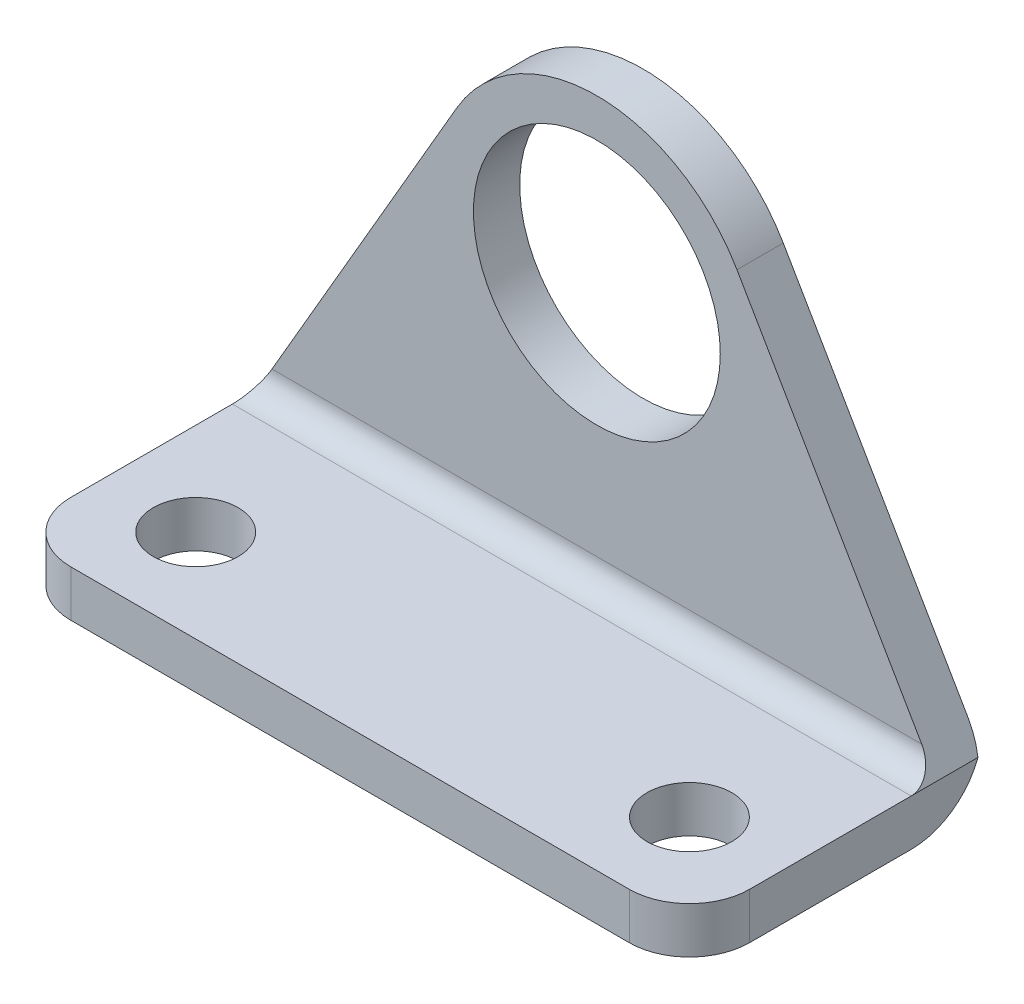
ISO-10303-21;
HEADER;
FILE_DESCRIPTION(('STEP AP214'),'2;1');
FILE_NAME('part.step','',(''),(''),'','','');
FILE_SCHEMA(('AUTOMOTIVE_DESIGN { 1 0 10303 214 1 1 1 1 }'));
ENDSEC;
DATA;
#1=APPLICATION_CONTEXT('core data for automotive mechanical design processes');
#2=APPLICATION_PROTOCOL_DEFINITION('international standard','automotive_design',2000,#1);
#3=PRODUCT_CONTEXT('',#1,'mechanical');
#4=PRODUCT('Part','Part','',(#3));
#5=PRODUCT_RELATED_PRODUCT_CATEGORY('part','',(#4));
#6=PRODUCT_DEFINITION_FORMATION('','',#4);
#7=PRODUCT_DEFINITION_CONTEXT('part definition',#1,'design');
#8=PRODUCT_DEFINITION('design','',#6,#7);
#9=PRODUCT_DEFINITION_SHAPE('','',#8);
#10=(LENGTH_UNIT() NAMED_UNIT(*) SI_UNIT(.MILLI.,.METRE.));
#11=(NAMED_UNIT(*) PLANE_ANGLE_UNIT() SI_UNIT($,.RADIAN.));
#12=(NAMED_UNIT(*) SI_UNIT($,.STERADIAN.) SOLID_ANGLE_UNIT());
#13=UNCERTAINTY_MEASURE_WITH_UNIT(LENGTH_MEASURE(1.E-05),#10,'distance_accuracy_value','');
#14=(GEOMETRIC_REPRESENTATION_CONTEXT(3) GLOBAL_UNCERTAINTY_ASSIGNED_CONTEXT((#13)) GLOBAL_UNIT_ASSIGNED_CONTEXT((#10,
#11,#12)) REPRESENTATION_CONTEXT('',''));
#15=CARTESIAN_POINT('',(0.,0.,0.));
#16=DIRECTION('',(0.,0.,1.));
#17=DIRECTION('',(1.,0.,0.));
#18=AXIS2_PLACEMENT_3D('',#15,#16,#17);
#19=CARTESIAN_POINT('',(22.,4.625,4.625));
#20=DIRECTION('',(-1.,0.,0.));
#21=DIRECTION('',(0.,0.,1.));
#22=AXIS2_PLACEMENT_3D('',#19,#20,#21);
#23=CYLINDRICAL_SURFACE('',#22,4.625);
#24=CARTESIAN_POINT('',(-21.057375262718,4.625,4.625));
#25=DIRECTION('',(-0.865002370637909,0.501767773766706,0.));
#26=DIRECTION('',(-0.501767773766707,-0.86500237063791,0.));
#27=AXIS2_PLACEMENT_3D('',#24,#25,#26);
#28=ELLIPSE('',#27,5.34680615567472,4.625);
#29=CARTESIAN_POINT('',(-21.057375262718,4.625,0.));
#30=VERTEX_POINT('',#29);
#31=CARTESIAN_POINT('',(-22.,3.,0.294872981077807));
#32=VERTEX_POINT('',#31);
#33=EDGE_CURVE('E156',#30,#32,#28,.T.);
#34=ORIENTED_EDGE('',*,*,#33,.F.);
#35=DIRECTION('',(-1.,0.,0.));
#36=VECTOR('',#35,1.);
#37=CARTESIAN_POINT('',(22.,4.625,0.));
#38=LINE('',#37,#36);
#39=CARTESIAN_POINT('',(21.057375262718,4.625,0.));
#40=VERTEX_POINT('',#39);
#41=EDGE_CURVE('E188',#40,#30,#38,.T.);
#42=ORIENTED_EDGE('',*,*,#41,.F.);
#43=CARTESIAN_POINT('',(21.057375262718,4.625,4.625));
#44=DIRECTION('',(0.865002370637909,0.501767773766706,0.));
#45=DIRECTION('',(-0.501767773766707,0.86500237063791,0.));
#46=AXIS2_PLACEMENT_3D('',#43,#44,#45);
#47=ELLIPSE('',#46,5.34680615567472,4.625);
#48=CARTESIAN_POINT('',(22.,3.,0.294872981077804));
#49=VERTEX_POINT('',#48);
#50=EDGE_CURVE('E163',#49,#40,#47,.T.);
#51=ORIENTED_EDGE('',*,*,#50,.F.);
#52=CARTESIAN_POINT('',(22.,4.625,4.625));
#53=DIRECTION('',(1.,0.,0.));
#54=DIRECTION('',(0.,0.,-1.));
#55=AXIS2_PLACEMENT_3D('',#52,#53,#54);
#56=CIRCLE('',#55,4.625);
#57=CARTESIAN_POINT('',(22.,0.,4.625));
#58=VERTEX_POINT('',#57);
#59=EDGE_CURVE('E169',#58,#49,#56,.T.);
#60=ORIENTED_EDGE('',*,*,#59,.F.);
#61=DIRECTION('',(-1.,0.,0.));
#62=VECTOR('',#61,1.);
#63=CARTESIAN_POINT('',(22.,0.,4.625));
#64=LINE('',#63,#62);
#65=CARTESIAN_POINT('',(-22.,0.,4.625));
#66=VERTEX_POINT('',#65);
#67=EDGE_CURVE('E191',#58,#66,#64,.T.);
#68=ORIENTED_EDGE('',*,*,#67,.T.);
#69=CARTESIAN_POINT('',(-22.,4.625,4.625));
#70=DIRECTION('',(1.,0.,0.));
#71=DIRECTION('',(0.,0.,-1.));
#72=AXIS2_PLACEMENT_3D('',#69,#70,#71);
#73=CIRCLE('',#72,4.625);
#74=EDGE_CURVE('E177',#66,#32,#73,.T.);
#75=ORIENTED_EDGE('',*,*,#74,.T.);
#76=EDGE_LOOP('',(#34,#42,#51,#60,#68,#75));
#77=FACE_BOUND('',#76,.T.);
#78=ADVANCED_FACE('F32',(#77),#23,.T.);
#79=CARTESIAN_POINT('',(22.,4.625,0.));
#80=DIRECTION('',(0.,0.,1.));
#81=DIRECTION('',(1.,0.,0.));
#82=AXIS2_PLACEMENT_3D('',#79,#80,#81);
#83=PLANE('',#82);
#84=CARTESIAN_POINT('',(0.,20.,0.));
#85=DIRECTION('',(0.,0.,1.));
#86=DIRECTION('',(1.,0.,0.));
#87=AXIS2_PLACEMENT_3D('',#84,#85,#86);
#88=CIRCLE('',#87,8.);
#89=CARTESIAN_POINT('',(8.,20.,0.));
#90=VERTEX_POINT('',#89);
#91=EDGE_CURVE('E146',#90,#90,#88,.T.);
#92=ORIENTED_EDGE('',*,*,#91,.T.);
#93=EDGE_LOOP('',(#92));
#94=FACE_BOUND('',#93,.T.);
#95=DIRECTION('',(-0.501767773766707,-0.86500237063791,0.));
#96=VECTOR('',#95,1.);
#97=CARTESIAN_POINT('',(-10.2167811932508,23.3132060974529,0.));
#98=LINE('',#97,#96);
#99=CARTESIAN_POINT('',(-9.08252489169805,25.2685616245504,0.));
#100=VERTEX_POINT('',#99);
#101=EDGE_CURVE('E140',#100,#30,#98,.T.);
#102=ORIENTED_EDGE('',*,*,#101,.F.);
#103=CARTESIAN_POINT('',(0.,20.,0.));
#104=DIRECTION('',(0.,0.,1.));
#105=DIRECTION('',(1.,0.,0.));
#106=AXIS2_PLACEMENT_3D('',#103,#104,#105);
#107=CIRCLE('',#106,10.5);
#108=CARTESIAN_POINT('',(9.08252489169805,25.2685616245504,0.));
#109=VERTEX_POINT('',#108);
#110=EDGE_CURVE('E144',#109,#100,#107,.T.);
#111=ORIENTED_EDGE('',*,*,#110,.F.);
#112=DIRECTION('',(-0.501767773766707,0.86500237063791,0.));
#113=VECTOR('',#112,1.);
#114=CARTESIAN_POINT('',(21.2947007400459,4.21587228946495,0.));
#115=LINE('',#114,#113);
#116=EDGE_CURVE('E161',#40,#109,#115,.T.);
#117=ORIENTED_EDGE('',*,*,#116,.F.);
#118=ORIENTED_EDGE('',*,*,#41,.T.);
#119=EDGE_LOOP('',(#102,#111,#117,#118));
#120=FACE_BOUND('',#119,.T.);
#121=ADVANCED_FACE('F241',(#94,#120),#83,.F.);
#122=CARTESIAN_POINT('',(22.,4.625,3.));
#123=DIRECTION('',(0.,0.,-1.));
#124=DIRECTION('',(-1.,0.,0.));
#125=AXIS2_PLACEMENT_3D('',#122,#123,#124);
#126=PLANE('',#125);
#127=CARTESIAN_POINT('',(0.,20.,3.));
#128=DIRECTION('',(0.,0.,1.));
#129=DIRECTION('',(1.,0.,0.));
#130=AXIS2_PLACEMENT_3D('',#127,#128,#129);
#131=CIRCLE('',#130,8.);
#132=CARTESIAN_POINT('',(8.,20.,3.));
#133=VERTEX_POINT('',#132);
#134=EDGE_CURVE('E150',#133,#133,#131,.T.);
#135=ORIENTED_EDGE('',*,*,#134,.F.);
#136=EDGE_LOOP('',(#135));
#137=FACE_BOUND('',#136,.T.);
#138=DIRECTION('',(0.501767773766707,0.86500237063791,0.));
#139=VECTOR('',#138,1.);
#140=CARTESIAN_POINT('',(-10.2167811932508,23.3132060974529,3.));
#141=LINE('',#140,#139);
#142=CARTESIAN_POINT('',(-21.057375262718,4.625,3.));
#143=VERTEX_POINT('',#142);
#144=CARTESIAN_POINT('',(-9.08252489169805,25.2685616245504,3.));
#145=VERTEX_POINT('',#144);
#146=EDGE_CURVE('E123',#143,#145,#141,.T.);
#147=ORIENTED_EDGE('',*,*,#146,.F.);
#148=DIRECTION('',(-1.,0.,0.));
#149=VECTOR('',#148,1.);
#150=CARTESIAN_POINT('',(22.,4.625,3.));
#151=LINE('',#150,#149);
#152=CARTESIAN_POINT('',(21.057375262718,4.625,3.));
#153=VERTEX_POINT('',#152);
#154=EDGE_CURVE('E186',#153,#143,#151,.T.);
#155=ORIENTED_EDGE('',*,*,#154,.F.);
#156=DIRECTION('',(0.501767773766707,-0.86500237063791,0.));
#157=VECTOR('',#156,1.);
#158=CARTESIAN_POINT('',(21.2947007400459,4.21587228946495,3.));
#159=LINE('',#158,#157);
#160=CARTESIAN_POINT('',(9.08252489169805,25.2685616245504,3.));
#161=VERTEX_POINT('',#160);
#162=EDGE_CURVE('E125',#161,#153,#159,.T.);
#163=ORIENTED_EDGE('',*,*,#162,.F.);
#164=CARTESIAN_POINT('',(0.,20.,3.));
#165=DIRECTION('',(0.,0.,-1.));
#166=DIRECTION('',(-1.,0.,0.));
#167=AXIS2_PLACEMENT_3D('',#164,#165,#166);
#168=CIRCLE('',#167,10.5);
#169=EDGE_CURVE('E119',#145,#161,#168,.T.);
#170=ORIENTED_EDGE('',*,*,#169,.F.);
#171=EDGE_LOOP('',(#147,#155,#163,#170));
#172=FACE_BOUND('',#171,.T.);
#173=ADVANCED_FACE('F121',(#137,#172),#126,.F.);
#174=CARTESIAN_POINT('',(22.,4.625,4.625));
#175=DIRECTION('',(-1.,0.,0.));
#176=DIRECTION('',(0.,0.,1.));
#177=AXIS2_PLACEMENT_3D('',#174,#175,#176);
#178=CYLINDRICAL_SURFACE('',#177,1.625);
#179=CARTESIAN_POINT('',(-21.057375262718,4.625,4.625));
#180=DIRECTION('',(-0.865002370637909,0.501767773766706,0.));
#181=DIRECTION('',(-0.501767773766707,-0.86500237063791,0.));
#182=AXIS2_PLACEMENT_3D('',#179,#180,#181);
#183=ELLIPSE('',#182,1.87860756821004,1.625);
#184=CARTESIAN_POINT('',(-22.,3.,4.625));
#185=VERTEX_POINT('',#184);
#186=EDGE_CURVE('E139',#185,#143,#183,.F.);
#187=ORIENTED_EDGE('',*,*,#186,.F.);
#188=DIRECTION('',(-1.,0.,0.));
#189=VECTOR('',#188,1.);
#190=CARTESIAN_POINT('',(22.,3.,4.625));
#191=LINE('',#190,#189);
#192=CARTESIAN_POINT('',(22.,3.,4.625));
#193=VERTEX_POINT('',#192);
#194=EDGE_CURVE('E183',#193,#185,#191,.T.);
#195=ORIENTED_EDGE('',*,*,#194,.F.);
#196=CARTESIAN_POINT('',(21.057375262718,4.625,4.625));
#197=DIRECTION('',(0.865002370637909,0.501767773766706,0.));
#198=DIRECTION('',(-0.501767773766707,0.86500237063791,0.));
#199=AXIS2_PLACEMENT_3D('',#196,#197,#198);
#200=ELLIPSE('',#199,1.87860756821004,1.625);
#201=EDGE_CURVE('E158',#153,#193,#200,.F.);
#202=ORIENTED_EDGE('',*,*,#201,.F.);
#203=ORIENTED_EDGE('',*,*,#154,.T.);
#204=EDGE_LOOP('',(#187,#195,#202,#203));
#205=FACE_BOUND('',#204,.T.);
#206=ADVANCED_FACE('F261',(#205),#178,.F.);
#207=CARTESIAN_POINT('',(22.,4.625,4.625));
#208=DIRECTION('',(1.,0.,0.));
#209=DIRECTION('',(0.,0.,-1.));
#210=AXIS2_PLACEMENT_3D('',#207,#208,#209);
#211=PLANE('',#210);
#212=DIRECTION('',(0.,0.,1.));
#213=VECTOR('',#212,1.);
#214=CARTESIAN_POINT('',(22.,3.,19.));
#215=LINE('',#214,#213);
#216=CARTESIAN_POINT('',(22.,3.,15.1));
#217=VERTEX_POINT('',#216);
#218=EDGE_CURVE('E173',#193,#217,#215,.T.);
#219=ORIENTED_EDGE('',*,*,#218,.T.);
#220=DIRECTION('',(0.,-1.,0.));
#221=VECTOR('',#220,1.);
#222=CARTESIAN_POINT('',(22.,0.,15.1));
#223=LINE('',#222,#221);
#224=CARTESIAN_POINT('',(22.,0.,15.1));
#225=VERTEX_POINT('',#224);
#226=EDGE_CURVE('E11',#217,#225,#223,.T.);
#227=ORIENTED_EDGE('',*,*,#226,.T.);
#228=DIRECTION('',(0.,0.,-1.));
#229=VECTOR('',#228,1.);
#230=CARTESIAN_POINT('',(22.,0.,19.));
#231=LINE('',#230,#229);
#232=EDGE_CURVE('E167',#225,#58,#231,.T.);
#233=ORIENTED_EDGE('',*,*,#232,.T.);
#234=ORIENTED_EDGE('',*,*,#59,.T.);
#235=DIRECTION('',(0.,0.,1.));
#236=VECTOR('',#235,1.);
#237=CARTESIAN_POINT('',(22.,3.,4.625));
#238=LINE('',#237,#236);
#239=EDGE_CURVE('E131',#49,#193,#238,.T.);
#240=ORIENTED_EDGE('',*,*,#239,.T.);
#241=EDGE_LOOP('',(#219,#227,#233,#234,#240));
#242=FACE_BOUND('',#241,.T.);
#243=ADVANCED_FACE('F232',(#242),#211,.T.);
#244=CARTESIAN_POINT('',(-22.,4.625,4.625));
#245=DIRECTION('',(1.,0.,0.));
#246=DIRECTION('',(0.,0.,-1.));
#247=AXIS2_PLACEMENT_3D('',#244,#245,#246);
#248=PLANE('',#247);
#249=DIRECTION('',(0.,0.,-1.));
#250=VECTOR('',#249,1.);
#251=CARTESIAN_POINT('',(-22.,0.,19.));
#252=LINE('',#251,#250);
#253=CARTESIAN_POINT('',(-22.,0.,15.1));
#254=VERTEX_POINT('',#253);
#255=EDGE_CURVE('E166',#254,#66,#252,.T.);
#256=ORIENTED_EDGE('',*,*,#255,.F.);
#257=DIRECTION('',(0.,-1.,0.));
#258=VECTOR('',#257,1.);
#259=CARTESIAN_POINT('',(-22.,4.625,15.1));
#260=LINE('',#259,#258);
#261=CARTESIAN_POINT('',(-22.,3.,15.1));
#262=VERTEX_POINT('',#261);
#263=EDGE_CURVE('E55',#254,#262,#260,.F.);
#264=ORIENTED_EDGE('',*,*,#263,.T.);
#265=DIRECTION('',(0.,0.,1.));
#266=VECTOR('',#265,1.);
#267=CARTESIAN_POINT('',(-22.,3.,19.));
#268=LINE('',#267,#266);
#269=EDGE_CURVE('E170',#185,#262,#268,.T.);
#270=ORIENTED_EDGE('',*,*,#269,.F.);
#271=DIRECTION('',(0.,0.,1.));
#272=VECTOR('',#271,1.);
#273=CARTESIAN_POINT('',(-22.,3.,4.625));
#274=LINE('',#273,#272);
#275=EDGE_CURVE('E197',#32,#185,#274,.T.);
#276=ORIENTED_EDGE('',*,*,#275,.F.);
#277=ORIENTED_EDGE('',*,*,#74,.F.);
#278=EDGE_LOOP('',(#256,#264,#270,#276,#277));
#279=FACE_BOUND('',#278,.T.);
#280=ADVANCED_FACE('F223',(#279),#248,.F.);
#281=CARTESIAN_POINT('',(22.,0.,19.));
#282=DIRECTION('',(0.,0.,-1.));
#283=DIRECTION('',(-1.,0.,0.));
#284=AXIS2_PLACEMENT_3D('',#281,#282,#283);
#285=PLANE('',#284);
#286=DIRECTION('',(-1.,0.,0.));
#287=VECTOR('',#286,1.);
#288=CARTESIAN_POINT('',(22.,3.,19.));
#289=LINE('',#288,#287);
#290=CARTESIAN_POINT('',(18.1,3.,19.));
#291=VERTEX_POINT('',#290);
#292=CARTESIAN_POINT('',(-18.1,3.,19.));
#293=VERTEX_POINT('',#292);
#294=EDGE_CURVE('E175',#291,#293,#289,.T.);
#295=ORIENTED_EDGE('',*,*,#294,.T.);
#296=DIRECTION('',(0.,-1.,0.));
#297=VECTOR('',#296,1.);
#298=CARTESIAN_POINT('',(-18.1,0.,19.));
#299=LINE('',#298,#297);
#300=CARTESIAN_POINT('',(-18.1,0.,19.));
#301=VERTEX_POINT('',#300);
#302=EDGE_CURVE('E202',#293,#301,#299,.T.);
#303=ORIENTED_EDGE('',*,*,#302,.T.);
#304=DIRECTION('',(-1.,0.,0.));
#305=VECTOR('',#304,1.);
#306=CARTESIAN_POINT('',(22.,0.,19.));
#307=LINE('',#306,#305);
#308=CARTESIAN_POINT('',(18.1,0.,19.));
#309=VERTEX_POINT('',#308);
#310=EDGE_CURVE('E194',#309,#301,#307,.T.);
#311=ORIENTED_EDGE('',*,*,#310,.F.);
#312=DIRECTION('',(0.,-1.,0.));
#313=VECTOR('',#312,1.);
#314=CARTESIAN_POINT('',(18.1,3.,19.));
#315=LINE('',#314,#313);
#316=EDGE_CURVE('E130',#309,#291,#315,.F.);
#317=ORIENTED_EDGE('',*,*,#316,.T.);
#318=EDGE_LOOP('',(#295,#303,#311,#317));
#319=FACE_BOUND('',#318,.T.);
#320=ADVANCED_FACE('F215',(#319),#285,.F.);
#321=CARTESIAN_POINT('',(22.,0.,19.));
#322=DIRECTION('',(0.,1.,0.));
#323=DIRECTION('',(0.,0.,1.));
#324=AXIS2_PLACEMENT_3D('',#321,#322,#323);
#325=PLANE('',#324);
#326=CARTESIAN_POINT('',(-16.,0.,13.));
#327=DIRECTION('',(0.,1.,0.));
#328=DIRECTION('',(0.,0.,-1.));
#329=AXIS2_PLACEMENT_3D('',#326,#327,#328);
#330=CIRCLE('',#329,2.75);
#331=CARTESIAN_POINT('',(-16.,0.,10.25));
#332=VERTEX_POINT('',#331);
#333=EDGE_CURVE('E284',#332,#332,#330,.T.);
#334=ORIENTED_EDGE('',*,*,#333,.T.);
#335=EDGE_LOOP('',(#334));
#336=FACE_BOUND('',#335,.T.);
#337=CARTESIAN_POINT('',(16.,0.,13.));
#338=DIRECTION('',(0.,1.,0.));
#339=DIRECTION('',(0.,0.,1.));
#340=AXIS2_PLACEMENT_3D('',#337,#338,#339);
#341=CIRCLE('',#340,2.75);
#342=CARTESIAN_POINT('',(16.,0.,15.75));
#343=VERTEX_POINT('',#342);
#344=EDGE_CURVE('E277',#343,#343,#341,.T.);
#345=ORIENTED_EDGE('',*,*,#344,.T.);
#346=EDGE_LOOP('',(#345));
#347=FACE_BOUND('',#346,.T.);
#348=ORIENTED_EDGE('',*,*,#310,.T.);
#349=CARTESIAN_POINT('',(-18.1,0.,15.1));
#350=DIRECTION('',(0.,1.,0.));
#351=DIRECTION('',(0.,0.,1.));
#352=AXIS2_PLACEMENT_3D('',#349,#350,#351);
#353=CIRCLE('',#352,3.9);
#354=EDGE_CURVE('E207',#301,#254,#353,.F.);
#355=ORIENTED_EDGE('',*,*,#354,.T.);
#356=ORIENTED_EDGE('',*,*,#255,.T.);
#357=ORIENTED_EDGE('',*,*,#67,.F.);
#358=ORIENTED_EDGE('',*,*,#232,.F.);
#359=CARTESIAN_POINT('',(18.1,0.,15.1));
#360=DIRECTION('',(0.,1.,0.));
#361=DIRECTION('',(0.,0.,1.));
#362=AXIS2_PLACEMENT_3D('',#359,#360,#361);
#363=CIRCLE('',#362,3.9);
#364=EDGE_CURVE('E205',#225,#309,#363,.F.);
#365=ORIENTED_EDGE('',*,*,#364,.T.);
#366=EDGE_LOOP('',(#348,#355,#356,#357,#358,#365));
#367=FACE_BOUND('',#366,.T.);
#368=ADVANCED_FACE('F220',(#336,#347,#367),#325,.F.);
#369=CARTESIAN_POINT('',(22.,3.,19.));
#370=DIRECTION('',(0.,-1.,0.));
#371=DIRECTION('',(0.,0.,-1.));
#372=AXIS2_PLACEMENT_3D('',#369,#370,#371);
#373=PLANE('',#372);
#374=CARTESIAN_POINT('',(-16.,3.,13.));
#375=DIRECTION('',(0.,1.,0.));
#376=DIRECTION('',(0.,0.,-1.));
#377=AXIS2_PLACEMENT_3D('',#374,#375,#376);
#378=CIRCLE('',#377,2.75);
#379=CARTESIAN_POINT('',(-16.,3.,10.25));
#380=VERTEX_POINT('',#379);
#381=EDGE_CURVE('E287',#380,#380,#378,.T.);
#382=ORIENTED_EDGE('',*,*,#381,.F.);
#383=EDGE_LOOP('',(#382));
#384=FACE_BOUND('',#383,.T.);
#385=CARTESIAN_POINT('',(16.,3.,13.));
#386=DIRECTION('',(0.,1.,0.));
#387=DIRECTION('',(0.,0.,1.));
#388=AXIS2_PLACEMENT_3D('',#385,#386,#387);
#389=CIRCLE('',#388,2.75);
#390=CARTESIAN_POINT('',(16.,3.,15.75));
#391=VERTEX_POINT('',#390);
#392=EDGE_CURVE('E279',#391,#391,#389,.T.);
#393=ORIENTED_EDGE('',*,*,#392,.F.);
#394=EDGE_LOOP('',(#393));
#395=FACE_BOUND('',#394,.T.);
#396=ORIENTED_EDGE('',*,*,#269,.T.);
#397=CARTESIAN_POINT('',(-18.1,3.,15.1));
#398=DIRECTION('',(0.,-1.,0.));
#399=DIRECTION('',(0.,0.,-1.));
#400=AXIS2_PLACEMENT_3D('',#397,#398,#399);
#401=CIRCLE('',#400,3.9);
#402=EDGE_CURVE('E40',#262,#293,#401,.F.);
#403=ORIENTED_EDGE('',*,*,#402,.T.);
#404=ORIENTED_EDGE('',*,*,#294,.F.);
#405=CARTESIAN_POINT('',(18.1,3.,15.1));
#406=DIRECTION('',(0.,-1.,0.));
#407=DIRECTION('',(0.,0.,-1.));
#408=AXIS2_PLACEMENT_3D('',#405,#406,#407);
#409=CIRCLE('',#408,3.9);
#410=EDGE_CURVE('E47',#291,#217,#409,.F.);
#411=ORIENTED_EDGE('',*,*,#410,.T.);
#412=ORIENTED_EDGE('',*,*,#218,.F.);
#413=ORIENTED_EDGE('',*,*,#194,.T.);
#414=EDGE_LOOP('',(#396,#403,#404,#411,#412,#413));
#415=FACE_BOUND('',#414,.T.);
#416=ADVANCED_FACE('F211',(#384,#395,#415),#373,.F.);
#417=CARTESIAN_POINT('',(0.,20.,71.4237541578243));
#418=DIRECTION('',(0.,0.,-1.));
#419=DIRECTION('',(-1.,0.,0.));
#420=AXIS2_PLACEMENT_3D('',#417,#418,#419);
#421=CYLINDRICAL_SURFACE('',#420,10.5);
#422=ORIENTED_EDGE('',*,*,#110,.T.);
#423=DIRECTION('',(0.,0.,-1.));
#424=VECTOR('',#423,1.);
#425=CARTESIAN_POINT('',(-9.08252489169805,25.2685616245504,71.4237541578243));
#426=LINE('',#425,#424);
#427=EDGE_CURVE('E136',#145,#100,#426,.T.);
#428=ORIENTED_EDGE('',*,*,#427,.F.);
#429=ORIENTED_EDGE('',*,*,#169,.T.);
#430=DIRECTION('',(0.,0.,-1.));
#431=VECTOR('',#430,1.);
#432=CARTESIAN_POINT('',(9.08252489169805,25.2685616245504,71.4237541578243));
#433=LINE('',#432,#431);
#434=EDGE_CURVE('E145',#161,#109,#433,.T.);
#435=ORIENTED_EDGE('',*,*,#434,.T.);
#436=EDGE_LOOP('',(#422,#428,#429,#435));
#437=FACE_BOUND('',#436,.T.);
#438=ADVANCED_FACE('F142',(#437),#421,.T.);
#439=CARTESIAN_POINT('',(9.08252489169805,25.2685616245504,71.4237541578243));
#440=DIRECTION('',(0.865002370637909,0.501767773766706,0.));
#441=DIRECTION('',(-0.501767773766707,0.86500237063791,0.));
#442=AXIS2_PLACEMENT_3D('',#439,#440,#441);
#443=PLANE('',#442);
#444=ORIENTED_EDGE('',*,*,#50,.T.);
#445=ORIENTED_EDGE('',*,*,#116,.T.);
#446=ORIENTED_EDGE('',*,*,#434,.F.);
#447=ORIENTED_EDGE('',*,*,#162,.T.);
#448=ORIENTED_EDGE('',*,*,#201,.T.);
#449=ORIENTED_EDGE('',*,*,#239,.F.);
#450=EDGE_LOOP('',(#444,#445,#446,#447,#448,#449));
#451=FACE_BOUND('',#450,.T.);
#452=ADVANCED_FACE('F313',(#451),#443,.T.);
#453=CARTESIAN_POINT('',(-9.08252489169805,25.2685616245504,71.4237541578243));
#454=DIRECTION('',(-0.865002370637909,0.501767773766706,0.));
#455=DIRECTION('',(-0.501767773766707,-0.86500237063791,0.));
#456=AXIS2_PLACEMENT_3D('',#453,#454,#455);
#457=PLANE('',#456);
#458=ORIENTED_EDGE('',*,*,#33,.T.);
#459=ORIENTED_EDGE('',*,*,#275,.T.);
#460=ORIENTED_EDGE('',*,*,#186,.T.);
#461=ORIENTED_EDGE('',*,*,#146,.T.);
#462=ORIENTED_EDGE('',*,*,#427,.T.);
#463=ORIENTED_EDGE('',*,*,#101,.T.);
#464=EDGE_LOOP('',(#458,#459,#460,#461,#462,#463));
#465=FACE_BOUND('',#464,.T.);
#466=ADVANCED_FACE('F135',(#465),#457,.T.);
#467=CARTESIAN_POINT('',(0.,20.,0.));
#468=DIRECTION('',(0.,0.,1.));
#469=DIRECTION('',(1.,0.,0.));
#470=AXIS2_PLACEMENT_3D('',#467,#468,#469);
#471=CYLINDRICAL_SURFACE('',#470,8.);
#472=ORIENTED_EDGE('',*,*,#91,.F.);
#473=EDGE_LOOP('',(#472));
#474=FACE_BOUND('',#473,.T.);
#475=ORIENTED_EDGE('',*,*,#134,.T.);
#476=EDGE_LOOP('',(#475));
#477=FACE_BOUND('',#476,.T.);
#478=ADVANCED_FACE('F302',(#474,#477),#471,.F.);
#479=CARTESIAN_POINT('',(16.,0.,13.));
#480=DIRECTION('',(0.,1.,0.));
#481=DIRECTION('',(0.,0.,1.));
#482=AXIS2_PLACEMENT_3D('',#479,#480,#481);
#483=CYLINDRICAL_SURFACE('',#482,2.75);
#484=ORIENTED_EDGE('',*,*,#344,.F.);
#485=EDGE_LOOP('',(#484));
#486=FACE_BOUND('',#485,.T.);
#487=ORIENTED_EDGE('',*,*,#392,.T.);
#488=EDGE_LOOP('',(#487));
#489=FACE_BOUND('',#488,.T.);
#490=ADVANCED_FACE('F295',(#486,#489),#483,.F.);
#491=CARTESIAN_POINT('',(-16.,0.,13.));
#492=DIRECTION('',(0.,1.,0.));
#493=DIRECTION('',(0.,0.,1.));
#494=AXIS2_PLACEMENT_3D('',#491,#492,#493);
#495=CYLINDRICAL_SURFACE('',#494,2.75);
#496=ORIENTED_EDGE('',*,*,#333,.F.);
#497=EDGE_LOOP('',(#496));
#498=FACE_BOUND('',#497,.T.);
#499=ORIENTED_EDGE('',*,*,#381,.T.);
#500=EDGE_LOOP('',(#499));
#501=FACE_BOUND('',#500,.T.);
#502=ADVANCED_FACE('F239',(#498,#501),#495,.F.);
#503=CARTESIAN_POINT('',(-18.1,0.,15.1));
#504=DIRECTION('',(0.,-1.,0.));
#505=DIRECTION('',(0.,0.,-1.));
#506=AXIS2_PLACEMENT_3D('',#503,#504,#505);
#507=CYLINDRICAL_SURFACE('',#506,3.9);
#508=ORIENTED_EDGE('',*,*,#402,.F.);
#509=ORIENTED_EDGE('',*,*,#263,.F.);
#510=ORIENTED_EDGE('',*,*,#354,.F.);
#511=ORIENTED_EDGE('',*,*,#302,.F.);
#512=EDGE_LOOP('',(#508,#509,#510,#511));
#513=FACE_BOUND('',#512,.T.);
#514=ADVANCED_FACE('F218',(#513),#507,.T.);
#515=CARTESIAN_POINT('',(18.1,4.625,15.1));
#516=DIRECTION('',(0.,1.,0.));
#517=DIRECTION('',(0.,0.,1.));
#518=AXIS2_PLACEMENT_3D('',#515,#516,#517);
#519=CYLINDRICAL_SURFACE('',#518,3.9);
#520=ORIENTED_EDGE('',*,*,#410,.F.);
#521=ORIENTED_EDGE('',*,*,#316,.F.);
#522=ORIENTED_EDGE('',*,*,#364,.F.);
#523=ORIENTED_EDGE('',*,*,#226,.F.);
#524=EDGE_LOOP('',(#520,#521,#522,#523));
#525=FACE_BOUND('',#524,.T.);
#526=ADVANCED_FACE('F34',(#525),#519,.T.);
#527=CLOSED_SHELL('',(#78,#121,#173,#206,#243,#280,#320,#368,#416,#438,#452,#466,#478,#490,#502,
#514,#526));
#528=MANIFOLD_SOLID_BREP('B2',#527);
#529=ADVANCED_BREP_SHAPE_REPRESENTATION('',(#18,#528),#14);
#530=SHAPE_DEFINITION_REPRESENTATION(#9,#529);
ENDSEC;
END-ISO-10303-21;
